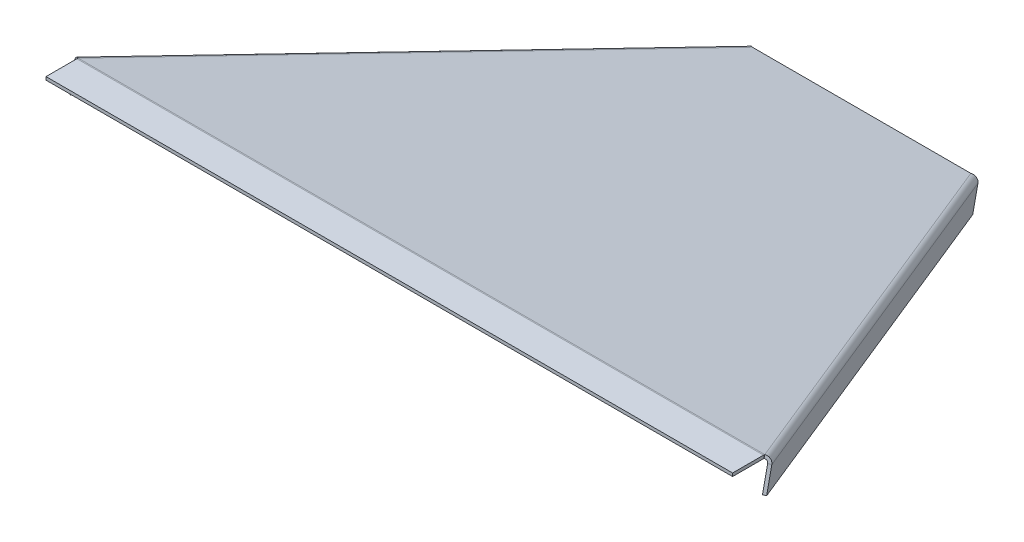
ISO-10303-21;
HEADER;
FILE_DESCRIPTION(('STEP AP214'),'2;1');
FILE_NAME('part.step','',(''),(''),'','','');
FILE_SCHEMA(('AUTOMOTIVE_DESIGN { 1 0 10303 214 1 1 1 1 }'));
ENDSEC;
DATA;
#1=APPLICATION_CONTEXT('core data for automotive mechanical design processes');
#2=APPLICATION_PROTOCOL_DEFINITION('international standard','automotive_design',2000,#1);
#3=PRODUCT_CONTEXT('',#1,'mechanical');
#4=PRODUCT('Part','Part','',(#3));
#5=PRODUCT_RELATED_PRODUCT_CATEGORY('part','',(#4));
#6=PRODUCT_DEFINITION_FORMATION('','',#4);
#7=PRODUCT_DEFINITION_CONTEXT('part definition',#1,'design');
#8=PRODUCT_DEFINITION('design','',#6,#7);
#9=PRODUCT_DEFINITION_SHAPE('','',#8);
#10=(LENGTH_UNIT() NAMED_UNIT(*) SI_UNIT(.MILLI.,.METRE.));
#11=(NAMED_UNIT(*) PLANE_ANGLE_UNIT() SI_UNIT($,.RADIAN.));
#12=(NAMED_UNIT(*) SI_UNIT($,.STERADIAN.) SOLID_ANGLE_UNIT());
#13=UNCERTAINTY_MEASURE_WITH_UNIT(LENGTH_MEASURE(1.E-05),#10,'distance_accuracy_value','');
#14=(GEOMETRIC_REPRESENTATION_CONTEXT(3) GLOBAL_UNCERTAINTY_ASSIGNED_CONTEXT((#13)) GLOBAL_UNIT_ASSIGNED_CONTEXT((#10,
#11,#12)) REPRESENTATION_CONTEXT('',''));
#15=CARTESIAN_POINT('',(0.,0.,0.));
#16=DIRECTION('',(0.,0.,1.));
#17=DIRECTION('',(1.,0.,0.));
#18=AXIS2_PLACEMENT_3D('',#15,#16,#17);
#19=CARTESIAN_POINT('',(-279.4,104.14,477.723454365452));
#20=DIRECTION('',(1.,0.,0.));
#21=DIRECTION('',(0.,0.,1.));
#22=AXIS2_PLACEMENT_3D('',#19,#20,#21);
#23=PLANE('',#22);
#24=DIRECTION('',(0.,1.,0.));
#25=VECTOR('',#24,1.);
#26=CARTESIAN_POINT('',(-279.4,104.14,478.257383880602));
#27=LINE('',#26,#25);
#28=CARTESIAN_POINT('',(-279.4,101.6,478.257383880602));
#29=VERTEX_POINT('',#28);
#30=CARTESIAN_POINT('',(-279.4,104.14,478.257383880602));
#31=VERTEX_POINT('',#30);
#32=EDGE_CURVE('E13',#29,#31,#27,.T.);
#33=ORIENTED_EDGE('',*,*,#32,.F.);
#34=DIRECTION('',(0.,0.,-1.));
#35=VECTOR('',#34,1.);
#36=CARTESIAN_POINT('',(-279.4,101.6,477.723454365452));
#37=LINE('',#36,#35);
#38=CARTESIAN_POINT('',(-279.4,101.6,503.390419123027));
#39=VERTEX_POINT('',#38);
#40=EDGE_CURVE('E128',#29,#39,#37,.F.);
#41=ORIENTED_EDGE('',*,*,#40,.T.);
#42=DIRECTION('',(0.,1.,0.));
#43=VECTOR('',#42,1.);
#44=CARTESIAN_POINT('',(-279.4,104.14,503.390419123027));
#45=LINE('',#44,#43);
#46=CARTESIAN_POINT('',(-279.4,104.14,503.390419123027));
#47=VERTEX_POINT('',#46);
#48=EDGE_CURVE('E86',#39,#47,#45,.T.);
#49=ORIENTED_EDGE('',*,*,#48,.T.);
#50=DIRECTION('',(0.,0.,1.));
#51=VECTOR('',#50,1.);
#52=CARTESIAN_POINT('',(-279.4,104.14,477.723454365452));
#53=LINE('',#52,#51);
#54=EDGE_CURVE('E130',#31,#47,#53,.T.);
#55=ORIENTED_EDGE('',*,*,#54,.F.);
#56=EDGE_LOOP('',(#33,#41,#49,#55));
#57=FACE_BOUND('',#56,.T.);
#58=ADVANCED_FACE('F77',(#57),#23,.F.);
#59=CARTESIAN_POINT('',(279.4,104.14,503.390419123027));
#60=DIRECTION('',(0.,0.,1.));
#61=DIRECTION('',(-1.,0.,0.));
#62=AXIS2_PLACEMENT_3D('',#59,#60,#61);
#63=PLANE('',#62);
#64=ORIENTED_EDGE('',*,*,#48,.F.);
#65=DIRECTION('',(1.,0.,0.));
#66=VECTOR('',#65,1.);
#67=CARTESIAN_POINT('',(279.4,101.6,503.390419123027));
#68=LINE('',#67,#66);
#69=CARTESIAN_POINT('',(279.4,101.6,503.390419123027));
#70=VERTEX_POINT('',#69);
#71=EDGE_CURVE('E155',#70,#39,#68,.F.);
#72=ORIENTED_EDGE('',*,*,#71,.F.);
#73=DIRECTION('',(0.,1.,0.));
#74=VECTOR('',#73,1.);
#75=CARTESIAN_POINT('',(279.4,104.14,503.390419123027));
#76=LINE('',#75,#74);
#77=CARTESIAN_POINT('',(279.4,104.14,503.390419123027));
#78=VERTEX_POINT('',#77);
#79=EDGE_CURVE('E170',#70,#78,#76,.T.);
#80=ORIENTED_EDGE('',*,*,#79,.T.);
#81=DIRECTION('',(-1.,0.,0.));
#82=VECTOR('',#81,1.);
#83=CARTESIAN_POINT('',(279.4,104.14,503.390419123027));
#84=LINE('',#83,#82);
#85=EDGE_CURVE('E179',#78,#47,#84,.T.);
#86=ORIENTED_EDGE('',*,*,#85,.T.);
#87=EDGE_LOOP('',(#64,#72,#80,#86));
#88=FACE_BOUND('',#87,.T.);
#89=ADVANCED_FACE('F184',(#88),#63,.T.);
#90=CARTESIAN_POINT('',(279.4,104.14,477.723454365452));
#91=DIRECTION('',(1.,0.,0.));
#92=DIRECTION('',(0.,0.,1.));
#93=AXIS2_PLACEMENT_3D('',#90,#91,#92);
#94=PLANE('',#93);
#95=ORIENTED_EDGE('',*,*,#79,.F.);
#96=DIRECTION('',(0.,0.,-1.));
#97=VECTOR('',#96,1.);
#98=CARTESIAN_POINT('',(279.4,101.6,477.723454365452));
#99=LINE('',#98,#97);
#100=CARTESIAN_POINT('',(279.4,101.6,478.257383880602));
#101=VERTEX_POINT('',#100);
#102=EDGE_CURVE('E201',#101,#70,#99,.F.);
#103=ORIENTED_EDGE('',*,*,#102,.F.);
#104=DIRECTION('',(0.,1.,0.));
#105=VECTOR('',#104,1.);
#106=CARTESIAN_POINT('',(279.4,104.14,478.257383880602));
#107=LINE('',#106,#105);
#108=CARTESIAN_POINT('',(279.4,104.14,478.257383880602));
#109=VERTEX_POINT('',#108);
#110=EDGE_CURVE('E102',#101,#109,#107,.T.);
#111=ORIENTED_EDGE('',*,*,#110,.T.);
#112=DIRECTION('',(0.,0.,1.));
#113=VECTOR('',#112,1.);
#114=CARTESIAN_POINT('',(279.4,104.14,477.723454365452));
#115=LINE('',#114,#113);
#116=EDGE_CURVE('E185',#109,#78,#115,.T.);
#117=ORIENTED_EDGE('',*,*,#116,.T.);
#118=EDGE_LOOP('',(#95,#103,#111,#117));
#119=FACE_BOUND('',#118,.T.);
#120=ADVANCED_FACE('F203',(#119),#94,.T.);
#121=CARTESIAN_POINT('',(279.4,99.0599999999999,478.257383880602));
#122=DIRECTION('',(-1.,0.,0.));
#123=DIRECTION('',(0.,0.,1.));
#124=AXIS2_PLACEMENT_3D('',#121,#122,#123);
#125=PLANE('',#124);
#126=ORIENTED_EDGE('',*,*,#110,.F.);
#127=CARTESIAN_POINT('',(279.4,99.0599999999999,478.257383880602));
#128=DIRECTION('',(-1.,0.,0.));
#129=DIRECTION('',(0.,0.,1.));
#130=AXIS2_PLACEMENT_3D('',#127,#128,#129);
#131=CIRCLE('',#130,2.54);
#132=CARTESIAN_POINT('',(279.4,101.544494905864,477.729288185925));
#133=VERTEX_POINT('',#132);
#134=EDGE_CURVE('E146',#101,#133,#131,.T.);
#135=ORIENTED_EDGE('',*,*,#134,.T.);
#136=DIRECTION('',(0.,0.978147600733807,-0.207911690817753));
#137=VECTOR('',#136,1.);
#138=CARTESIAN_POINT('',(279.4,104.028989811728,477.201192491248));
#139=LINE('',#138,#137);
#140=CARTESIAN_POINT('',(279.4,104.028989811728,477.201192491248));
#141=VERTEX_POINT('',#140);
#142=EDGE_CURVE('E166',#133,#141,#139,.T.);
#143=ORIENTED_EDGE('',*,*,#142,.T.);
#144=CARTESIAN_POINT('',(279.4,99.0599999999999,478.257383880602));
#145=DIRECTION('',(1.,0.,0.));
#146=DIRECTION('',(0.,0.,-1.));
#147=AXIS2_PLACEMENT_3D('',#144,#145,#146);
#148=CIRCLE('',#147,5.08);
#149=EDGE_CURVE('E182',#109,#141,#148,.F.);
#150=ORIENTED_EDGE('',*,*,#149,.F.);
#151=EDGE_LOOP('',(#126,#135,#143,#150));
#152=FACE_BOUND('',#151,.T.);
#153=ADVANCED_FACE('F206',(#152),#125,.F.);
#154=CARTESIAN_POINT('',(279.4,27.8844949058641,118.969509086081));
#155=DIRECTION('',(0.,0.207911690817753,0.978147600733807));
#156=DIRECTION('',(-1.,0.,0.));
#157=AXIS2_PLACEMENT_3D('',#154,#155,#156);
#158=PLANE('',#157);
#159=DIRECTION('',(0.,0.978147600733807,-0.207911690817753));
#160=VECTOR('',#159,1.);
#161=CARTESIAN_POINT('',(88.9,-52.6716373032428,136.092243569897));
#162=LINE('',#161,#160);
#163=CARTESIAN_POINT('',(88.9,25.4000000000029,119.497604780771));
#164=VERTEX_POINT('',#163);
#165=CARTESIAN_POINT('',(88.9,27.8844949058668,118.969509086093));
#166=VERTEX_POINT('',#165);
#167=EDGE_CURVE('E231',#164,#166,#162,.T.);
#168=ORIENTED_EDGE('',*,*,#167,.F.);
#169=DIRECTION('',(1.,0.,0.));
#170=VECTOR('',#169,1.);
#171=CARTESIAN_POINT('',(279.4,25.4000000000002,119.497604780758));
#172=LINE('',#171,#170);
#173=CARTESIAN_POINT('',(-88.9,25.4000000000002,119.497604780758));
#174=VERTEX_POINT('',#173);
#175=EDGE_CURVE('E150',#164,#174,#172,.F.);
#176=ORIENTED_EDGE('',*,*,#175,.T.);
#177=DIRECTION('',(0.,0.978147600733807,-0.207911690817753));
#178=VECTOR('',#177,1.);
#179=CARTESIAN_POINT('',(-88.9,-52.6716373032455,136.092243569884));
#180=LINE('',#179,#178);
#181=CARTESIAN_POINT('',(-88.8999999999998,27.8844949058643,118.969509086081));
#182=VERTEX_POINT('',#181);
#183=EDGE_CURVE('E265',#174,#182,#180,.T.);
#184=ORIENTED_EDGE('',*,*,#183,.T.);
#185=DIRECTION('',(-1.,0.,0.));
#186=VECTOR('',#185,1.);
#187=CARTESIAN_POINT('',(279.4,27.8844949058641,118.969509086081));
#188=LINE('',#187,#186);
#189=EDGE_CURVE('E187',#166,#182,#188,.T.);
#190=ORIENTED_EDGE('',*,*,#189,.F.);
#191=EDGE_LOOP('',(#168,#176,#184,#190));
#192=FACE_BOUND('',#191,.T.);
#193=ADVANCED_FACE('F232',(#192),#158,.F.);
#194=CARTESIAN_POINT('',(-279.4,99.0599999999999,478.257383880602));
#195=DIRECTION('',(1.,0.,0.));
#196=DIRECTION('',(0.,0.,-1.));
#197=AXIS2_PLACEMENT_3D('',#194,#195,#196);
#198=PLANE('',#197);
#199=CARTESIAN_POINT('',(-279.4,99.0599999999999,478.257383880602));
#200=DIRECTION('',(-1.,0.,0.));
#201=DIRECTION('',(0.,0.,1.));
#202=AXIS2_PLACEMENT_3D('',#199,#200,#201);
#203=CIRCLE('',#202,2.54);
#204=CARTESIAN_POINT('',(-279.4,101.544494905864,477.729288185925));
#205=VERTEX_POINT('',#204);
#206=EDGE_CURVE('E144',#205,#29,#203,.F.);
#207=ORIENTED_EDGE('',*,*,#206,.T.);
#208=ORIENTED_EDGE('',*,*,#32,.T.);
#209=CARTESIAN_POINT('',(-279.4,99.0599999999999,478.257383880602));
#210=DIRECTION('',(-1.,0.,0.));
#211=DIRECTION('',(0.,0.,1.));
#212=AXIS2_PLACEMENT_3D('',#209,#210,#211);
#213=CIRCLE('',#212,5.08);
#214=CARTESIAN_POINT('',(-279.4,104.028989811728,477.201192491248));
#215=VERTEX_POINT('',#214);
#216=EDGE_CURVE('E196',#215,#31,#213,.F.);
#217=ORIENTED_EDGE('',*,*,#216,.F.);
#218=DIRECTION('',(0.,0.978147600733806,-0.207911690817755));
#219=VECTOR('',#218,1.);
#220=CARTESIAN_POINT('',(-279.4,104.028989811728,477.201192491248));
#221=LINE('',#220,#219);
#222=EDGE_CURVE('E81',#205,#215,#221,.T.);
#223=ORIENTED_EDGE('',*,*,#222,.F.);
#224=EDGE_LOOP('',(#207,#208,#217,#223));
#225=FACE_BOUND('',#224,.T.);
#226=ADVANCED_FACE('F79',(#225),#198,.F.);
#227=CARTESIAN_POINT('',(279.4,104.14,477.723454365452));
#228=DIRECTION('',(0.,-0.978147600733807,0.207911690817753));
#229=DIRECTION('',(0.,-0.207911690817753,-0.978147600733807));
#230=AXIS2_PLACEMENT_3D('',#227,#228,#229);
#231=PLANE('',#230);
#232=DIRECTION('',(-1.,0.,0.));
#233=VECTOR('',#232,1.);
#234=CARTESIAN_POINT('',(279.4,104.028989811728,477.201192491248));
#235=LINE('',#234,#233);
#236=EDGE_CURVE('E193',#215,#141,#235,.F.);
#237=ORIENTED_EDGE('',*,*,#236,.T.);
#238=DIRECTION('',(0.461463151128807,0.184450806091181,0.867772816054171));
#239=VECTOR('',#238,1.);
#240=CARTESIAN_POINT('',(279.4,104.028989811728,477.201192491248));
#241=LINE('',#240,#239);
#242=EDGE_CURVE('E239',#166,#141,#241,.T.);
#243=ORIENTED_EDGE('',*,*,#242,.F.);
#244=ORIENTED_EDGE('',*,*,#189,.T.);
#245=DIRECTION('',(0.461463151128794,-0.184450806091182,-0.867772816054177));
#246=VECTOR('',#245,1.);
#247=CARTESIAN_POINT('',(-88.9,27.8844949058641,118.969509086081));
#248=LINE('',#247,#246);
#249=EDGE_CURVE('E219',#215,#182,#248,.T.);
#250=ORIENTED_EDGE('',*,*,#249,.F.);
#251=EDGE_LOOP('',(#237,#243,#244,#250));
#252=FACE_BOUND('',#251,.T.);
#253=ADVANCED_FACE('F397',(#252),#231,.F.);
#254=CARTESIAN_POINT('',(279.4,104.14,477.723454365452));
#255=DIRECTION('',(0.,-1.,0.));
#256=DIRECTION('',(0.,0.,-1.));
#257=AXIS2_PLACEMENT_3D('',#254,#255,#256);
#258=PLANE('',#257);
#259=ORIENTED_EDGE('',*,*,#116,.F.);
#260=DIRECTION('',(-1.,0.,0.));
#261=VECTOR('',#260,1.);
#262=CARTESIAN_POINT('',(279.4,104.14,478.257383880602));
#263=LINE('',#262,#261);
#264=EDGE_CURVE('E181',#109,#31,#263,.T.);
#265=ORIENTED_EDGE('',*,*,#264,.T.);
#266=ORIENTED_EDGE('',*,*,#54,.T.);
#267=ORIENTED_EDGE('',*,*,#85,.F.);
#268=EDGE_LOOP('',(#259,#265,#266,#267));
#269=FACE_BOUND('',#268,.T.);
#270=ADVANCED_FACE('F178',(#269),#258,.F.);
#271=CARTESIAN_POINT('',(279.4,99.0599999999999,478.257383880602));
#272=DIRECTION('',(-1.,0.,0.));
#273=DIRECTION('',(0.,0.,1.));
#274=AXIS2_PLACEMENT_3D('',#271,#272,#273);
#275=CYLINDRICAL_SURFACE('',#274,5.08);
#276=ORIENTED_EDGE('',*,*,#149,.T.);
#277=ORIENTED_EDGE('',*,*,#236,.F.);
#278=ORIENTED_EDGE('',*,*,#216,.T.);
#279=ORIENTED_EDGE('',*,*,#264,.F.);
#280=EDGE_LOOP('',(#276,#277,#278,#279));
#281=FACE_BOUND('',#280,.T.);
#282=ADVANCED_FACE('F212',(#281),#275,.T.);
#283=CARTESIAN_POINT('',(279.4,101.655505094136,478.251550060129));
#284=DIRECTION('',(0.,-0.978147600733807,0.207911690817753));
#285=DIRECTION('',(0.,-0.207911690817753,-0.978147600733807));
#286=AXIS2_PLACEMENT_3D('',#283,#284,#285);
#287=PLANE('',#286);
#288=DIRECTION('',(-0.461463151128807,-0.184450806091181,-0.867772816054171));
#289=VECTOR('',#288,1.);
#290=CARTESIAN_POINT('',(279.618586131233,101.631865669938,478.140335313277));
#291=LINE('',#290,#289);
#292=EDGE_CURVE('E159',#133,#164,#291,.T.);
#293=ORIENTED_EDGE('',*,*,#292,.F.);
#294=DIRECTION('',(1.,0.,0.));
#295=VECTOR('',#294,1.);
#296=CARTESIAN_POINT('',(279.4,101.544494905864,477.729288185925));
#297=LINE('',#296,#295);
#298=EDGE_CURVE('E149',#205,#133,#297,.T.);
#299=ORIENTED_EDGE('',*,*,#298,.F.);
#300=DIRECTION('',(-0.461463151128794,0.184450806091182,0.867772816054177));
#301=VECTOR('',#300,1.);
#302=CARTESIAN_POINT('',(-160.623109703212,54.0683462542201,254.371569757319));
#303=LINE('',#302,#301);
#304=EDGE_CURVE('E93',#174,#205,#303,.T.);
#305=ORIENTED_EDGE('',*,*,#304,.F.);
#306=ORIENTED_EDGE('',*,*,#175,.F.);
#307=EDGE_LOOP('',(#293,#299,#305,#306));
#308=FACE_BOUND('',#307,.T.);
#309=ADVANCED_FACE('F241',(#308),#287,.T.);
#310=CARTESIAN_POINT('',(279.4,101.6,477.723454365452));
#311=DIRECTION('',(0.,-1.,0.));
#312=DIRECTION('',(0.,0.,-1.));
#313=AXIS2_PLACEMENT_3D('',#310,#311,#312);
#314=PLANE('',#313);
#315=ORIENTED_EDGE('',*,*,#102,.T.);
#316=ORIENTED_EDGE('',*,*,#71,.T.);
#317=ORIENTED_EDGE('',*,*,#40,.F.);
#318=DIRECTION('',(1.,0.,0.));
#319=VECTOR('',#318,1.);
#320=CARTESIAN_POINT('',(279.4,101.6,478.257383880602));
#321=LINE('',#320,#319);
#322=EDGE_CURVE('E140',#101,#29,#321,.F.);
#323=ORIENTED_EDGE('',*,*,#322,.F.);
#324=EDGE_LOOP('',(#315,#316,#317,#323));
#325=FACE_BOUND('',#324,.T.);
#326=ADVANCED_FACE('F153',(#325),#314,.T.);
#327=CARTESIAN_POINT('',(279.4,99.0599999999999,478.257383880602));
#328=DIRECTION('',(-1.,0.,0.));
#329=DIRECTION('',(0.,0.,1.));
#330=AXIS2_PLACEMENT_3D('',#327,#328,#329);
#331=CYLINDRICAL_SURFACE('',#330,2.54);
#332=ORIENTED_EDGE('',*,*,#134,.F.);
#333=ORIENTED_EDGE('',*,*,#322,.T.);
#334=ORIENTED_EDGE('',*,*,#206,.F.);
#335=ORIENTED_EDGE('',*,*,#298,.T.);
#336=EDGE_LOOP('',(#332,#333,#334,#335));
#337=FACE_BOUND('',#336,.T.);
#338=ADVANCED_FACE('F141',(#337),#331,.F.);
#339=CARTESIAN_POINT('',(88.9,22.9155050941391,120.025700475448));
#340=DIRECTION('',(-0.461463151128807,-0.18445080609118,-0.867772816054171));
#341=DIRECTION('',(-0.882922218642529,0.,0.469519281635327));
#342=AXIS2_PLACEMENT_3D('',#339,#340,#341);
#343=PLANE('',#342);
#344=DIRECTION('',(0.887159376972521,-0.0959435840012755,-0.451379074103705));
#345=VECTOR('',#344,1.);
#346=CARTESIAN_POINT('',(93.4067696350204,22.4281116874126,117.732694779001));
#347=LINE('',#346,#345);
#348=CARTESIAN_POINT('',(91.1533848175103,22.6718083907759,118.879197627224));
#349=VERTEX_POINT('',#348);
#350=CARTESIAN_POINT('',(93.4067696350205,22.4281116874126,117.732694779001));
#351=VERTEX_POINT('',#350);
#352=EDGE_CURVE('E255',#349,#351,#347,.T.);
#353=ORIENTED_EDGE('',*,*,#352,.F.);
#354=CARTESIAN_POINT('',(88.9,22.9155050941391,120.025700475448));
#355=DIRECTION('',(0.461463151128807,0.18445080609118,0.867772816054171));
#356=DIRECTION('',(0.882922218642529,0.,-0.469519281635327));
#357=AXIS2_PLACEMENT_3D('',#354,#355,#356);
#358=CIRCLE('',#357,2.54000000000004);
#359=EDGE_CURVE('E248',#164,#349,#358,.F.);
#360=ORIENTED_EDGE('',*,*,#359,.F.);
#361=ORIENTED_EDGE('',*,*,#167,.T.);
#362=CARTESIAN_POINT('',(88.9,22.9155050941391,120.025700475448));
#363=DIRECTION('',(0.461463151128807,0.18445080609118,0.867772816054171));
#364=DIRECTION('',(0.882922218642529,0.,-0.469519281635327));
#365=AXIS2_PLACEMENT_3D('',#362,#363,#364);
#366=CIRCLE('',#365,5.08000000000004);
#367=EDGE_CURVE('E259',#166,#351,#366,.F.);
#368=ORIENTED_EDGE('',*,*,#367,.T.);
#369=EDGE_LOOP('',(#353,#360,#361,#368));
#370=FACE_BOUND('',#369,.T.);
#371=ADVANCED_FACE('F253',(#370),#343,.T.);
#372=CARTESIAN_POINT('',(279.4,99.0599999999998,478.257383880602));
#373=DIRECTION('',(-0.461463151128807,-0.18445080609118,-0.867772816054171));
#374=DIRECTION('',(-0.882922218642529,0.,0.469519281635327));
#375=AXIS2_PLACEMENT_3D('',#372,#373,#374);
#376=PLANE('',#375);
#377=CARTESIAN_POINT('',(279.4,99.0599999999998,478.257383880602));
#378=DIRECTION('',(0.461463151128807,0.18445080609118,0.867772816054171));
#379=DIRECTION('',(0.882922218642529,0.,-0.469519281635327));
#380=AXIS2_PLACEMENT_3D('',#377,#378,#379);
#381=CIRCLE('',#380,2.54000000000004);
#382=CARTESIAN_POINT('',(281.65338481751,98.8163032966366,477.110881032378));
#383=VERTEX_POINT('',#382);
#384=EDGE_CURVE('E251',#383,#133,#381,.T.);
#385=ORIENTED_EDGE('',*,*,#384,.F.);
#386=DIRECTION('',(0.887159376972521,-0.0959435840012754,-0.451379074103705));
#387=VECTOR('',#386,1.);
#388=CARTESIAN_POINT('',(281.65338481751,98.8163032966366,477.110881032378));
#389=LINE('',#388,#387);
#390=CARTESIAN_POINT('',(283.90676963502,98.5726065932734,475.964378184155));
#391=VERTEX_POINT('',#390);
#392=EDGE_CURVE('E322',#383,#391,#389,.T.);
#393=ORIENTED_EDGE('',*,*,#392,.T.);
#394=CARTESIAN_POINT('',(279.4,99.0599999999998,478.257383880602));
#395=DIRECTION('',(0.461463151128807,0.18445080609118,0.867772816054171));
#396=DIRECTION('',(0.882922218642529,0.,-0.469519281635327));
#397=AXIS2_PLACEMENT_3D('',#394,#395,#396);
#398=CIRCLE('',#397,5.08000000000004);
#399=EDGE_CURVE('E256',#391,#141,#398,.T.);
#400=ORIENTED_EDGE('',*,*,#399,.T.);
#401=ORIENTED_EDGE('',*,*,#142,.F.);
#402=EDGE_LOOP('',(#385,#393,#400,#401));
#403=FACE_BOUND('',#402,.T.);
#404=ADVANCED_FACE('F362',(#403),#376,.F.);
#405=CARTESIAN_POINT('',(279.4,99.0599999999999,478.257383880602));
#406=DIRECTION('',(0.461463151128807,0.18445080609118,0.867772816054171));
#407=DIRECTION('',(0.887159376972521,-0.0959435840012755,-0.451379074103705));
#408=AXIS2_PLACEMENT_3D('',#405,#406,#407);
#409=CYLINDRICAL_SURFACE('',#408,5.08000000000004);
#410=ORIENTED_EDGE('',*,*,#242,.T.);
#411=ORIENTED_EDGE('',*,*,#399,.F.);
#412=DIRECTION('',(0.461463151128807,0.184450806091181,0.867772816054171));
#413=VECTOR('',#412,1.);
#414=CARTESIAN_POINT('',(24.4614533209575,-5.12992656381645,-11.9176817358948));
#415=LINE('',#414,#413);
#416=EDGE_CURVE('E319',#351,#391,#415,.T.);
#417=ORIENTED_EDGE('',*,*,#416,.F.);
#418=ORIENTED_EDGE('',*,*,#367,.F.);
#419=EDGE_LOOP('',(#410,#411,#417,#418));
#420=FACE_BOUND('',#419,.T.);
#421=ADVANCED_FACE('F373',(#420),#409,.T.);
#422=CARTESIAN_POINT('',(279.4,99.0599999999999,478.257383880602));
#423=DIRECTION('',(0.461463151128807,0.18445080609118,0.867772816054171));
#424=DIRECTION('',(0.887159376972521,-0.0959435840012755,-0.451379074103705));
#425=AXIS2_PLACEMENT_3D('',#422,#423,#424);
#426=CYLINDRICAL_SURFACE('',#425,2.54000000000004);
#427=ORIENTED_EDGE('',*,*,#292,.T.);
#428=ORIENTED_EDGE('',*,*,#359,.T.);
#429=DIRECTION('',(-0.461463151128807,-0.184450806091181,-0.867772816054171));
#430=VECTOR('',#429,1.);
#431=CARTESIAN_POINT('',(91.1533848175102,22.6718083907758,118.879197627224));
#432=LINE('',#431,#430);
#433=EDGE_CURVE('E325',#349,#383,#432,.F.);
#434=ORIENTED_EDGE('',*,*,#433,.T.);
#435=ORIENTED_EDGE('',*,*,#384,.T.);
#436=EDGE_LOOP('',(#427,#428,#434,#435));
#437=FACE_BOUND('',#436,.T.);
#438=ADVANCED_FACE('F245',(#437),#426,.F.);
#439=CARTESIAN_POINT('',(283.90676963502,101.057101499137,475.436282489478));
#440=DIRECTION('',(0.461463151128807,0.184450806091181,0.867772816054171));
#441=DIRECTION('',(0.88292221864253,0.,-0.469519281635327));
#442=AXIS2_PLACEMENT_3D('',#439,#440,#441);
#443=PLANE('',#442);
#444=DIRECTION('',(0.,0.978147600733808,-0.207911690817751));
#445=VECTOR('',#444,1.);
#446=CARTESIAN_POINT('',(283.90676963502,101.057101499137,475.436282489478));
#447=LINE('',#446,#445);
#448=CARTESIAN_POINT('',(283.906769635021,78.6966473463625,480.189143741572));
#449=VERTEX_POINT('',#448);
#450=EDGE_CURVE('E301',#449,#391,#447,.T.);
#451=ORIENTED_EDGE('',*,*,#450,.T.);
#452=ORIENTED_EDGE('',*,*,#392,.F.);
#453=DIRECTION('',(0.,-0.978147600733808,0.207911690817751));
#454=VECTOR('',#453,1.);
#455=CARTESIAN_POINT('',(281.65338481751,101.3007982025,476.582785337701));
#456=LINE('',#455,#454);
#457=CARTESIAN_POINT('',(281.65338481751,78.9403440497257,481.335646589795));
#458=VERTEX_POINT('',#457);
#459=EDGE_CURVE('E310',#458,#383,#456,.F.);
#460=ORIENTED_EDGE('',*,*,#459,.F.);
#461=DIRECTION('',(-0.887159376972521,0.0959435840012749,0.451379074103705));
#462=VECTOR('',#461,1.);
#463=CARTESIAN_POINT('',(283.906769635021,78.6966473463625,480.189143741572));
#464=LINE('',#463,#462);
#465=EDGE_CURVE('E261',#449,#458,#464,.T.);
#466=ORIENTED_EDGE('',*,*,#465,.F.);
#467=EDGE_LOOP('',(#451,#452,#460,#466));
#468=FACE_BOUND('',#467,.T.);
#469=ADVANCED_FACE('F365',(#468),#443,.T.);
#470=CARTESIAN_POINT('',(93.4067696350205,2.5521524405016,121.957460336417));
#471=DIRECTION('',(-0.461463151128807,-0.18445080609118,-0.867772816054171));
#472=DIRECTION('',(-0.88292221864253,0.,0.469519281635327));
#473=AXIS2_PLACEMENT_3D('',#470,#471,#472);
#474=PLANE('',#473);
#475=DIRECTION('',(0.,0.978147600733808,-0.20791169081775));
#476=VECTOR('',#475,1.);
#477=CARTESIAN_POINT('',(91.1533848175102,25.1563032966395,118.351101932547));
#478=LINE('',#477,#476);
#479=CARTESIAN_POINT('',(91.1533848175103,2.79584914386486,123.103963184641));
#480=VERTEX_POINT('',#479);
#481=EDGE_CURVE('E316',#349,#480,#478,.F.);
#482=ORIENTED_EDGE('',*,*,#481,.F.);
#483=ORIENTED_EDGE('',*,*,#352,.T.);
#484=DIRECTION('',(0.,-0.978147600733808,0.20791169081775));
#485=VECTOR('',#484,1.);
#486=CARTESIAN_POINT('',(93.4067696350205,2.5521524405016,121.957460336417));
#487=LINE('',#486,#485);
#488=CARTESIAN_POINT('',(93.4067696350205,2.55215244050162,121.957460336417));
#489=VERTEX_POINT('',#488);
#490=EDGE_CURVE('E307',#351,#489,#487,.T.);
#491=ORIENTED_EDGE('',*,*,#490,.T.);
#492=DIRECTION('',(-0.887159376972521,0.0959435840012749,0.451379074103705));
#493=VECTOR('',#492,1.);
#494=CARTESIAN_POINT('',(93.4067696350205,2.55215244050162,121.957460336417));
#495=LINE('',#494,#493);
#496=EDGE_CURVE('E298',#489,#480,#495,.T.);
#497=ORIENTED_EDGE('',*,*,#496,.T.);
#498=EDGE_LOOP('',(#482,#483,#491,#497));
#499=FACE_BOUND('',#498,.T.);
#500=ADVANCED_FACE('F334',(#499),#474,.T.);
#501=CARTESIAN_POINT('',(24.4614533209575,-2.64543165795255,-12.4457774305719));
#502=DIRECTION('',(0.887159376972521,-0.0959435840012755,-0.451379074103705));
#503=DIRECTION('',(-0.453471038755341,0.,-0.891271012100221));
#504=AXIS2_PLACEMENT_3D('',#501,#502,#503);
#505=PLANE('',#504);
#506=ORIENTED_EDGE('',*,*,#490,.F.);
#507=ORIENTED_EDGE('',*,*,#416,.T.);
#508=ORIENTED_EDGE('',*,*,#450,.F.);
#509=DIRECTION('',(0.461463151128807,0.184450806091181,0.867772816054171));
#510=VECTOR('',#509,1.);
#511=CARTESIAN_POINT('',(283.906769635021,78.6966473463625,480.189143741572));
#512=LINE('',#511,#510);
#513=EDGE_CURVE('E304',#489,#449,#512,.T.);
#514=ORIENTED_EDGE('',*,*,#513,.F.);
#515=EDGE_LOOP('',(#506,#507,#508,#514));
#516=FACE_BOUND('',#515,.T.);
#517=ADVANCED_FACE('F339',(#516),#505,.T.);
#518=CARTESIAN_POINT('',(22.2080685034473,-2.40173495458931,-11.2992745823485));
#519=DIRECTION('',(0.887159376972521,-0.0959435840012755,-0.451379074103705));
#520=DIRECTION('',(-0.453471038755341,0.,-0.891271012100221));
#521=AXIS2_PLACEMENT_3D('',#518,#519,#520);
#522=PLANE('',#521);
#523=ORIENTED_EDGE('',*,*,#433,.F.);
#524=ORIENTED_EDGE('',*,*,#481,.T.);
#525=DIRECTION('',(-0.461463151128807,-0.184450806091181,-0.867772816054171));
#526=VECTOR('',#525,1.);
#527=CARTESIAN_POINT('',(22.2080685034474,-24.7621891073642,-6.54641333025466));
#528=LINE('',#527,#526);
#529=EDGE_CURVE('E313',#480,#458,#528,.F.);
#530=ORIENTED_EDGE('',*,*,#529,.T.);
#531=ORIENTED_EDGE('',*,*,#459,.T.);
#532=EDGE_LOOP('',(#523,#524,#530,#531));
#533=FACE_BOUND('',#532,.T.);
#534=ADVANCED_FACE('F364',(#533),#522,.F.);
#535=CARTESIAN_POINT('',(283.906769635021,78.6966473463625,480.189143741572));
#536=DIRECTION('',(0.,-0.978147600733807,0.207911690817751));
#537=DIRECTION('',(0.,-0.207911690817751,-0.978147600733807));
#538=AXIS2_PLACEMENT_3D('',#535,#536,#537);
#539=PLANE('',#538);
#540=ORIENTED_EDGE('',*,*,#529,.F.);
#541=ORIENTED_EDGE('',*,*,#496,.F.);
#542=ORIENTED_EDGE('',*,*,#513,.T.);
#543=ORIENTED_EDGE('',*,*,#465,.T.);
#544=EDGE_LOOP('',(#540,#541,#542,#543));
#545=FACE_BOUND('',#544,.T.);
#546=ADVANCED_FACE('F347',(#545),#539,.T.);
#547=CARTESIAN_POINT('',(-279.4,99.0599999999997,478.257383880602));
#548=DIRECTION('',(-0.461463151128793,0.184450806091181,0.867772816054178));
#549=DIRECTION('',(0.882922218642537,0.,0.469519281635313));
#550=AXIS2_PLACEMENT_3D('',#547,#548,#549);
#551=PLANE('',#550);
#552=DIRECTION('',(-0.887159376972528,-0.0959435840012716,-0.451379074103693));
#553=VECTOR('',#552,1.);
#554=CARTESIAN_POINT('',(-283.90676963502,98.5726065932734,475.964378184155));
#555=LINE('',#554,#553);
#556=CARTESIAN_POINT('',(-281.65338481751,98.8163032966365,477.110881032378));
#557=VERTEX_POINT('',#556);
#558=CARTESIAN_POINT('',(-283.90676963502,98.5726065932733,475.964378184155));
#559=VERTEX_POINT('',#558);
#560=EDGE_CURVE('E286',#557,#559,#555,.T.);
#561=ORIENTED_EDGE('',*,*,#560,.F.);
#562=CARTESIAN_POINT('',(-279.4,99.0599999999997,478.257383880602));
#563=DIRECTION('',(0.461463151128793,-0.184450806091181,-0.867772816054178));
#564=DIRECTION('',(-0.882922218642537,0.,-0.469519281635313));
#565=AXIS2_PLACEMENT_3D('',#562,#563,#564);
#566=CIRCLE('',#565,2.54000000000008);
#567=EDGE_CURVE('E276',#205,#557,#566,.F.);
#568=ORIENTED_EDGE('',*,*,#567,.F.);
#569=ORIENTED_EDGE('',*,*,#222,.T.);
#570=CARTESIAN_POINT('',(-279.4,99.0599999999997,478.257383880602));
#571=DIRECTION('',(0.461463151128793,-0.184450806091181,-0.867772816054178));
#572=DIRECTION('',(-0.882922218642537,0.,-0.469519281635313));
#573=AXIS2_PLACEMENT_3D('',#570,#571,#572);
#574=CIRCLE('',#573,5.08000000000008);
#575=EDGE_CURVE('E290',#215,#559,#574,.F.);
#576=ORIENTED_EDGE('',*,*,#575,.T.);
#577=EDGE_LOOP('',(#561,#568,#569,#576));
#578=FACE_BOUND('',#577,.T.);
#579=ADVANCED_FACE('F282',(#578),#551,.T.);
#580=CARTESIAN_POINT('',(-88.9000000000002,22.9155050941365,120.025700475435));
#581=DIRECTION('',(-0.461463151128793,0.184450806091181,0.867772816054178));
#582=DIRECTION('',(0.882922218642537,0.,0.469519281635313));
#583=AXIS2_PLACEMENT_3D('',#580,#581,#582);
#584=PLANE('',#583);
#585=CARTESIAN_POINT('',(-88.9000000000002,22.9155050941365,120.025700475435));
#586=DIRECTION('',(0.461463151128793,-0.184450806091181,-0.867772816054178));
#587=DIRECTION('',(-0.882922218642537,0.,-0.469519281635313));
#588=AXIS2_PLACEMENT_3D('',#585,#586,#587);
#589=CIRCLE('',#588,2.54000000000008);
#590=CARTESIAN_POINT('',(-91.1533848175105,22.6718083907732,118.879197627211));
#591=VERTEX_POINT('',#590);
#592=EDGE_CURVE('E279',#591,#174,#589,.T.);
#593=ORIENTED_EDGE('',*,*,#592,.F.);
#594=DIRECTION('',(-0.887159376972528,-0.0959435840012717,-0.451379074103693));
#595=VECTOR('',#594,1.);
#596=CARTESIAN_POINT('',(-91.1533848175102,22.6718083907731,118.879197627211));
#597=LINE('',#596,#595);
#598=CARTESIAN_POINT('',(-93.4067696350205,22.4281116874098,117.732694778988));
#599=VERTEX_POINT('',#598);
#600=EDGE_CURVE('E482',#591,#599,#597,.T.);
#601=ORIENTED_EDGE('',*,*,#600,.T.);
#602=CARTESIAN_POINT('',(-88.9000000000002,22.9155050941365,120.025700475435));
#603=DIRECTION('',(0.461463151128793,-0.184450806091181,-0.867772816054178));
#604=DIRECTION('',(-0.882922218642537,0.,-0.469519281635313));
#605=AXIS2_PLACEMENT_3D('',#602,#603,#604);
#606=CIRCLE('',#605,5.08000000000008);
#607=EDGE_CURVE('E287',#599,#182,#606,.T.);
#608=ORIENTED_EDGE('',*,*,#607,.T.);
#609=ORIENTED_EDGE('',*,*,#183,.F.);
#610=EDGE_LOOP('',(#593,#601,#608,#609));
#611=FACE_BOUND('',#610,.T.);
#612=ADVANCED_FACE('F412',(#611),#584,.F.);
#613=CARTESIAN_POINT('',(-88.9000000000002,22.9155050941365,120.025700475435));
#614=DIRECTION('',(0.461463151128793,-0.184450806091181,-0.867772816054178));
#615=DIRECTION('',(-0.887159376972529,-0.0959435840012715,-0.451379074103692));
#616=AXIS2_PLACEMENT_3D('',#613,#614,#615);
#617=CYLINDRICAL_SURFACE('',#616,5.08000000000008);
#618=ORIENTED_EDGE('',*,*,#249,.T.);
#619=ORIENTED_EDGE('',*,*,#607,.F.);
#620=DIRECTION('',(0.461463151128794,-0.184450806091182,-0.867772816054177));
#621=VECTOR('',#620,1.);
#622=CARTESIAN_POINT('',(-24.4614533209651,-5.12992656381718,-11.9176817358982));
#623=LINE('',#622,#621);
#624=EDGE_CURVE('E458',#559,#599,#623,.T.);
#625=ORIENTED_EDGE('',*,*,#624,.F.);
#626=ORIENTED_EDGE('',*,*,#575,.F.);
#627=EDGE_LOOP('',(#618,#619,#625,#626));
#628=FACE_BOUND('',#627,.T.);
#629=ADVANCED_FACE('F420',(#628),#617,.T.);
#630=CARTESIAN_POINT('',(-88.9000000000002,22.9155050941365,120.025700475435));
#631=DIRECTION('',(0.461463151128793,-0.184450806091181,-0.867772816054178));
#632=DIRECTION('',(-0.887159376972529,-0.0959435840012715,-0.451379074103692));
#633=AXIS2_PLACEMENT_3D('',#630,#631,#632);
#634=CYLINDRICAL_SURFACE('',#633,2.54000000000008);
#635=ORIENTED_EDGE('',*,*,#304,.T.);
#636=ORIENTED_EDGE('',*,*,#567,.T.);
#637=DIRECTION('',(-0.461463151128794,0.184450806091182,0.867772816054177));
#638=VECTOR('',#637,1.);
#639=CARTESIAN_POINT('',(-281.65338481751,98.8163032966367,477.110881032378));
#640=LINE('',#639,#638);
#641=EDGE_CURVE('E485',#557,#591,#640,.F.);
#642=ORIENTED_EDGE('',*,*,#641,.T.);
#643=ORIENTED_EDGE('',*,*,#592,.T.);
#644=EDGE_LOOP('',(#635,#636,#642,#643));
#645=FACE_BOUND('',#644,.T.);
#646=ADVANCED_FACE('F273',(#645),#634,.F.);
#647=CARTESIAN_POINT('',(-93.4067696350205,24.9126065932737,117.204599084311));
#648=DIRECTION('',(0.461463151128794,-0.184450806091182,-0.867772816054177));
#649=DIRECTION('',(-0.882922218642537,0.,-0.469519281635314));
#650=AXIS2_PLACEMENT_3D('',#647,#648,#649);
#651=PLANE('',#650);
#652=DIRECTION('',(0.,0.978147600733807,-0.207911690817751));
#653=VECTOR('',#652,1.);
#654=CARTESIAN_POINT('',(-93.4067696350205,24.9126065932737,117.204599084311));
#655=LINE('',#654,#653);
#656=CARTESIAN_POINT('',(-93.4067696350206,2.55215244049885,121.957460336405));
#657=VERTEX_POINT('',#656);
#658=EDGE_CURVE('E469',#657,#599,#655,.T.);
#659=ORIENTED_EDGE('',*,*,#658,.T.);
#660=ORIENTED_EDGE('',*,*,#600,.F.);
#661=DIRECTION('',(0.,-0.978147600733807,0.207911690817751));
#662=VECTOR('',#661,1.);
#663=CARTESIAN_POINT('',(-91.1533848175102,25.156303296637,118.351101932534));
#664=LINE('',#663,#662);
#665=CARTESIAN_POINT('',(-91.1533848175103,2.79584914386208,123.103963184628));
#666=VERTEX_POINT('',#665);
#667=EDGE_CURVE('E467',#666,#591,#664,.F.);
#668=ORIENTED_EDGE('',*,*,#667,.F.);
#669=DIRECTION('',(0.887159376972528,0.0959435840012722,0.451379074103692));
#670=VECTOR('',#669,1.);
#671=CARTESIAN_POINT('',(-93.4067696350206,2.55215244049886,121.957460336405));
#672=LINE('',#671,#670);
#673=EDGE_CURVE('E292',#657,#666,#672,.T.);
#674=ORIENTED_EDGE('',*,*,#673,.F.);
#675=EDGE_LOOP('',(#659,#660,#668,#674));
#676=FACE_BOUND('',#675,.T.);
#677=ADVANCED_FACE('F425',(#676),#651,.T.);
#678=CARTESIAN_POINT('',(-283.90676963502,78.6966473463625,480.189143741572));
#679=DIRECTION('',(-0.461463151128794,0.184450806091176,0.867772816054179));
#680=DIRECTION('',(0.882922218642537,0.,0.469519281635313));
#681=AXIS2_PLACEMENT_3D('',#678,#679,#680);
#682=PLANE('',#681);
#683=DIRECTION('',(0.,0.978147600733809,-0.207911690817746));
#684=VECTOR('',#683,1.);
#685=CARTESIAN_POINT('',(-281.65338481751,101.300798202497,476.582785337702));
#686=LINE('',#685,#684);
#687=CARTESIAN_POINT('',(-281.65338481751,78.9403440497257,481.335646589795));
#688=VERTEX_POINT('',#687);
#689=EDGE_CURVE('E478',#557,#688,#686,.F.);
#690=ORIENTED_EDGE('',*,*,#689,.F.);
#691=ORIENTED_EDGE('',*,*,#560,.T.);
#692=DIRECTION('',(0.,-0.978147600733809,0.207911690817746));
#693=VECTOR('',#692,1.);
#694=CARTESIAN_POINT('',(-283.90676963502,78.6966473463624,480.189143741572));
#695=LINE('',#694,#693);
#696=CARTESIAN_POINT('',(-283.90676963502,78.6966473463624,480.189143741572));
#697=VERTEX_POINT('',#696);
#698=EDGE_CURVE('E454',#559,#697,#695,.T.);
#699=ORIENTED_EDGE('',*,*,#698,.T.);
#700=DIRECTION('',(0.887159376972528,0.0959435840012721,0.451379074103692));
#701=VECTOR('',#700,1.);
#702=CARTESIAN_POINT('',(-283.90676963502,78.6966473463625,480.189143741572));
#703=LINE('',#702,#701);
#704=EDGE_CURVE('E489',#697,#688,#703,.T.);
#705=ORIENTED_EDGE('',*,*,#704,.T.);
#706=EDGE_LOOP('',(#690,#691,#699,#705));
#707=FACE_BOUND('',#706,.T.);
#708=ADVANCED_FACE('F429',(#707),#682,.T.);
#709=CARTESIAN_POINT('',(-24.4614533209651,-2.64543165795325,-12.4457774305753));
#710=DIRECTION('',(-0.887159376972528,-0.0959435840012716,-0.451379074103693));
#711=DIRECTION('',(-0.453471038755328,0.,0.891271012100228));
#712=AXIS2_PLACEMENT_3D('',#709,#710,#711);
#713=PLANE('',#712);
#714=ORIENTED_EDGE('',*,*,#698,.F.);
#715=ORIENTED_EDGE('',*,*,#624,.T.);
#716=ORIENTED_EDGE('',*,*,#658,.F.);
#717=DIRECTION('',(0.461463151128794,-0.184450806091182,-0.867772816054177));
#718=VECTOR('',#717,1.);
#719=CARTESIAN_POINT('',(-93.4067696350206,2.55215244049885,121.957460336405));
#720=LINE('',#719,#718);
#721=EDGE_CURVE('E462',#697,#657,#720,.T.);
#722=ORIENTED_EDGE('',*,*,#721,.F.);
#723=EDGE_LOOP('',(#714,#715,#716,#722));
#724=FACE_BOUND('',#723,.T.);
#725=ADVANCED_FACE('F432',(#724),#713,.T.);
#726=CARTESIAN_POINT('',(-22.2080685034548,-2.40173495459002,-11.2992745823519));
#727=DIRECTION('',(-0.887159376972528,-0.0959435840012716,-0.451379074103693));
#728=DIRECTION('',(-0.453471038755328,0.,0.891271012100228));
#729=AXIS2_PLACEMENT_3D('',#726,#727,#728);
#730=PLANE('',#729);
#731=ORIENTED_EDGE('',*,*,#641,.F.);
#732=ORIENTED_EDGE('',*,*,#689,.T.);
#733=DIRECTION('',(-0.461463151128794,0.184450806091182,0.867772816054177));
#734=VECTOR('',#733,1.);
#735=CARTESIAN_POINT('',(-22.2080685034549,-24.7621891073649,-6.54641333025809));
#736=LINE('',#735,#734);
#737=EDGE_CURVE('E472',#688,#666,#736,.F.);
#738=ORIENTED_EDGE('',*,*,#737,.T.);
#739=ORIENTED_EDGE('',*,*,#667,.T.);
#740=EDGE_LOOP('',(#731,#732,#738,#739));
#741=FACE_BOUND('',#740,.T.);
#742=ADVANCED_FACE('F437',(#741),#730,.F.);
#743=CARTESIAN_POINT('',(-93.4067696350206,2.55215244049886,121.957460336405));
#744=DIRECTION('',(0.,-0.978147600733807,0.207911690817751));
#745=DIRECTION('',(0.,-0.207911690817751,-0.978147600733807));
#746=AXIS2_PLACEMENT_3D('',#743,#744,#745);
#747=PLANE('',#746);
#748=ORIENTED_EDGE('',*,*,#737,.F.);
#749=ORIENTED_EDGE('',*,*,#704,.F.);
#750=ORIENTED_EDGE('',*,*,#721,.T.);
#751=ORIENTED_EDGE('',*,*,#673,.T.);
#752=EDGE_LOOP('',(#748,#749,#750,#751));
#753=FACE_BOUND('',#752,.T.);
#754=ADVANCED_FACE('F434',(#753),#747,.T.);
#755=CLOSED_SHELL('',(#58,#89,#120,#153,#193,#226,#253,#270,#282,#309,#326,#338,#371,#404,#421,
#438,#469,#500,#517,#534,#546,#579,#612,#629,#646,#677,#708,#725,#742,#754));
#756=MANIFOLD_SOLID_BREP('B2',#755);
#757=ADVANCED_BREP_SHAPE_REPRESENTATION('',(#18,#756),#14);
#758=SHAPE_DEFINITION_REPRESENTATION(#9,#757);
ENDSEC;
END-ISO-10303-21;
